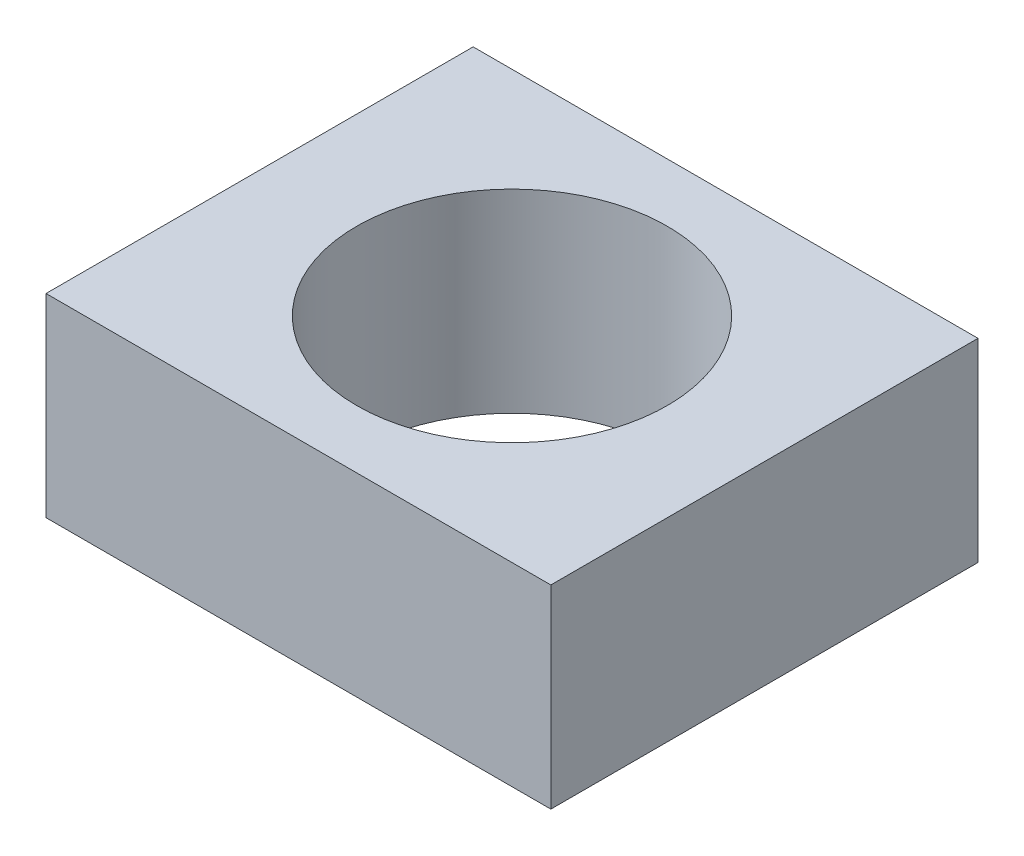
ISO-10303-21;
HEADER;
FILE_DESCRIPTION(('STEP AP214'),'2;1');
FILE_NAME('part.step','',(''),(''),'','','');
FILE_SCHEMA(('AUTOMOTIVE_DESIGN { 1 0 10303 214 1 1 1 1 }'));
ENDSEC;
DATA;
#1=APPLICATION_CONTEXT('core data for automotive mechanical design processes');
#2=APPLICATION_PROTOCOL_DEFINITION('international standard','automotive_design',2000,#1);
#3=PRODUCT_CONTEXT('',#1,'mechanical');
#4=PRODUCT('Part','Part','',(#3));
#5=PRODUCT_RELATED_PRODUCT_CATEGORY('part','',(#4));
#6=PRODUCT_DEFINITION_FORMATION('','',#4);
#7=PRODUCT_DEFINITION_CONTEXT('part definition',#1,'design');
#8=PRODUCT_DEFINITION('design','',#6,#7);
#9=PRODUCT_DEFINITION_SHAPE('','',#8);
#10=(LENGTH_UNIT() NAMED_UNIT(*) SI_UNIT(.MILLI.,.METRE.));
#11=(NAMED_UNIT(*) PLANE_ANGLE_UNIT() SI_UNIT($,.RADIAN.));
#12=(NAMED_UNIT(*) SI_UNIT($,.STERADIAN.) SOLID_ANGLE_UNIT());
#13=UNCERTAINTY_MEASURE_WITH_UNIT(LENGTH_MEASURE(1.E-05),#10,'distance_accuracy_value','');
#14=(GEOMETRIC_REPRESENTATION_CONTEXT(3) GLOBAL_UNCERTAINTY_ASSIGNED_CONTEXT((#13)) GLOBAL_UNIT_ASSIGNED_CONTEXT((#10,
#11,#12)) REPRESENTATION_CONTEXT('',''));
#15=CARTESIAN_POINT('',(0.,0.,0.));
#16=DIRECTION('',(0.,0.,1.));
#17=DIRECTION('',(1.,0.,0.));
#18=AXIS2_PLACEMENT_3D('',#15,#16,#17);
#19=CARTESIAN_POINT('',(6.5,5.,-5.5));
#20=DIRECTION('',(-1.,0.,0.));
#21=DIRECTION('',(0.,0.,1.));
#22=AXIS2_PLACEMENT_3D('',#19,#20,#21);
#23=PLANE('',#22);
#24=DIRECTION('',(0.,0.,-1.));
#25=VECTOR('',#24,1.);
#26=CARTESIAN_POINT('',(6.5,0.,-5.5));
#27=LINE('',#26,#25);
#28=CARTESIAN_POINT('',(6.5,0.,5.5));
#29=VERTEX_POINT('',#28);
#30=CARTESIAN_POINT('',(6.5,0.,-5.5));
#31=VERTEX_POINT('',#30);
#32=EDGE_CURVE('E107',#29,#31,#27,.T.);
#33=ORIENTED_EDGE('',*,*,#32,.T.);
#34=DIRECTION('',(0.,-1.,0.));
#35=VECTOR('',#34,1.);
#36=CARTESIAN_POINT('',(6.5,5.,-5.5));
#37=LINE('',#36,#35);
#38=CARTESIAN_POINT('',(6.5,5.,-5.5));
#39=VERTEX_POINT('',#38);
#40=EDGE_CURVE('E11',#39,#31,#37,.T.);
#41=ORIENTED_EDGE('',*,*,#40,.F.);
#42=DIRECTION('',(0.,0.,-1.));
#43=VECTOR('',#42,1.);
#44=CARTESIAN_POINT('',(6.5,5.,-5.5));
#45=LINE('',#44,#43);
#46=CARTESIAN_POINT('',(6.5,5.,5.5));
#47=VERTEX_POINT('',#46);
#48=EDGE_CURVE('E91',#47,#39,#45,.T.);
#49=ORIENTED_EDGE('',*,*,#48,.F.);
#50=DIRECTION('',(0.,-1.,0.));
#51=VECTOR('',#50,1.);
#52=CARTESIAN_POINT('',(6.5,5.,5.5));
#53=LINE('',#52,#51);
#54=EDGE_CURVE('E103',#47,#29,#53,.T.);
#55=ORIENTED_EDGE('',*,*,#54,.T.);
#56=EDGE_LOOP('',(#33,#41,#49,#55));
#57=FACE_BOUND('',#56,.T.);
#58=ADVANCED_FACE('F39',(#57),#23,.F.);
#59=CARTESIAN_POINT('',(-6.5,5.,-5.5));
#60=DIRECTION('',(0.,0.,1.));
#61=DIRECTION('',(1.,0.,0.));
#62=AXIS2_PLACEMENT_3D('',#59,#60,#61);
#63=PLANE('',#62);
#64=DIRECTION('',(-1.,0.,0.));
#65=VECTOR('',#64,1.);
#66=CARTESIAN_POINT('',(-6.5,0.,-5.5));
#67=LINE('',#66,#65);
#68=CARTESIAN_POINT('',(-6.5,0.,-5.5));
#69=VERTEX_POINT('',#68);
#70=EDGE_CURVE('E96',#31,#69,#67,.T.);
#71=ORIENTED_EDGE('',*,*,#70,.T.);
#72=DIRECTION('',(0.,-1.,0.));
#73=VECTOR('',#72,1.);
#74=CARTESIAN_POINT('',(-6.5,5.,-5.5));
#75=LINE('',#74,#73);
#76=CARTESIAN_POINT('',(-6.5,5.,-5.5));
#77=VERTEX_POINT('',#76);
#78=EDGE_CURVE('E48',#77,#69,#75,.T.);
#79=ORIENTED_EDGE('',*,*,#78,.F.);
#80=DIRECTION('',(-1.,0.,0.));
#81=VECTOR('',#80,1.);
#82=CARTESIAN_POINT('',(-6.5,5.,-5.5));
#83=LINE('',#82,#81);
#84=EDGE_CURVE('E86',#39,#77,#83,.T.);
#85=ORIENTED_EDGE('',*,*,#84,.F.);
#86=ORIENTED_EDGE('',*,*,#40,.T.);
#87=EDGE_LOOP('',(#71,#79,#85,#86));
#88=FACE_BOUND('',#87,.T.);
#89=ADVANCED_FACE('F95',(#88),#63,.F.);
#90=CARTESIAN_POINT('',(-6.5,5.,-5.5));
#91=DIRECTION('',(1.,0.,0.));
#92=DIRECTION('',(0.,0.,-1.));
#93=AXIS2_PLACEMENT_3D('',#90,#91,#92);
#94=PLANE('',#93);
#95=DIRECTION('',(0.,0.,1.));
#96=VECTOR('',#95,1.);
#97=CARTESIAN_POINT('',(-6.5,0.,-5.5));
#98=LINE('',#97,#96);
#99=CARTESIAN_POINT('',(-6.5,0.,5.5));
#100=VERTEX_POINT('',#99);
#101=EDGE_CURVE('E73',#69,#100,#98,.T.);
#102=ORIENTED_EDGE('',*,*,#101,.T.);
#103=DIRECTION('',(0.,-1.,0.));
#104=VECTOR('',#103,1.);
#105=CARTESIAN_POINT('',(-6.5,5.,5.5));
#106=LINE('',#105,#104);
#107=CARTESIAN_POINT('',(-6.5,5.,5.5));
#108=VERTEX_POINT('',#107);
#109=EDGE_CURVE('E98',#108,#100,#106,.T.);
#110=ORIENTED_EDGE('',*,*,#109,.F.);
#111=DIRECTION('',(0.,0.,1.));
#112=VECTOR('',#111,1.);
#113=CARTESIAN_POINT('',(-6.5,5.,-5.5));
#114=LINE('',#113,#112);
#115=EDGE_CURVE('E89',#77,#108,#114,.T.);
#116=ORIENTED_EDGE('',*,*,#115,.F.);
#117=ORIENTED_EDGE('',*,*,#78,.T.);
#118=EDGE_LOOP('',(#102,#110,#116,#117));
#119=FACE_BOUND('',#118,.T.);
#120=ADVANCED_FACE('F99',(#119),#94,.F.);
#121=CARTESIAN_POINT('',(-6.5,5.,5.5));
#122=DIRECTION('',(0.,0.,-1.));
#123=DIRECTION('',(-1.,0.,0.));
#124=AXIS2_PLACEMENT_3D('',#121,#122,#123);
#125=PLANE('',#124);
#126=DIRECTION('',(1.,0.,0.));
#127=VECTOR('',#126,1.);
#128=CARTESIAN_POINT('',(-6.5,0.,5.5));
#129=LINE('',#128,#127);
#130=EDGE_CURVE('E79',#100,#29,#129,.T.);
#131=ORIENTED_EDGE('',*,*,#130,.T.);
#132=ORIENTED_EDGE('',*,*,#54,.F.);
#133=DIRECTION('',(1.,0.,0.));
#134=VECTOR('',#133,1.);
#135=CARTESIAN_POINT('',(-6.5,5.,5.5));
#136=LINE('',#135,#134);
#137=EDGE_CURVE('E56',#108,#47,#136,.T.);
#138=ORIENTED_EDGE('',*,*,#137,.F.);
#139=ORIENTED_EDGE('',*,*,#109,.T.);
#140=EDGE_LOOP('',(#131,#132,#138,#139));
#141=FACE_BOUND('',#140,.T.);
#142=ADVANCED_FACE('F121',(#141),#125,.F.);
#143=CARTESIAN_POINT('',(0.,5.,0.));
#144=DIRECTION('',(0.,1.,0.));
#145=DIRECTION('',(0.,0.,1.));
#146=AXIS2_PLACEMENT_3D('',#143,#144,#145);
#147=PLANE('',#146);
#148=CARTESIAN_POINT('',(0.,5.,0.));
#149=DIRECTION('',(0.,1.,0.));
#150=DIRECTION('',(0.,0.,1.));
#151=AXIS2_PLACEMENT_3D('',#148,#149,#150);
#152=CIRCLE('',#151,4.);
#153=CARTESIAN_POINT('',(0.,5.,4.));
#154=VERTEX_POINT('',#153);
#155=EDGE_CURVE('E128',#154,#154,#152,.T.);
#156=ORIENTED_EDGE('',*,*,#155,.F.);
#157=EDGE_LOOP('',(#156));
#158=FACE_BOUND('',#157,.T.);
#159=ORIENTED_EDGE('',*,*,#48,.T.);
#160=ORIENTED_EDGE('',*,*,#84,.T.);
#161=ORIENTED_EDGE('',*,*,#115,.T.);
#162=ORIENTED_EDGE('',*,*,#137,.T.);
#163=EDGE_LOOP('',(#159,#160,#161,#162));
#164=FACE_BOUND('',#163,.T.);
#165=ADVANCED_FACE('F87',(#158,#164),#147,.T.);
#166=CARTESIAN_POINT('',(0.,0.,0.));
#167=DIRECTION('',(0.,1.,0.));
#168=DIRECTION('',(0.,0.,1.));
#169=AXIS2_PLACEMENT_3D('',#166,#167,#168);
#170=PLANE('',#169);
#171=CARTESIAN_POINT('',(0.,0.,0.));
#172=DIRECTION('',(0.,1.,0.));
#173=DIRECTION('',(0.,0.,1.));
#174=AXIS2_PLACEMENT_3D('',#171,#172,#173);
#175=CIRCLE('',#174,4.);
#176=CARTESIAN_POINT('',(0.,0.,4.));
#177=VERTEX_POINT('',#176);
#178=EDGE_CURVE('E111',#177,#177,#175,.T.);
#179=ORIENTED_EDGE('',*,*,#178,.T.);
#180=EDGE_LOOP('',(#179));
#181=FACE_BOUND('',#180,.T.);
#182=ORIENTED_EDGE('',*,*,#32,.F.);
#183=ORIENTED_EDGE('',*,*,#130,.F.);
#184=ORIENTED_EDGE('',*,*,#101,.F.);
#185=ORIENTED_EDGE('',*,*,#70,.F.);
#186=EDGE_LOOP('',(#182,#183,#184,#185));
#187=FACE_BOUND('',#186,.T.);
#188=ADVANCED_FACE('F124',(#181,#187),#170,.F.);
#189=CARTESIAN_POINT('',(0.,0.,0.));
#190=DIRECTION('',(0.,1.,0.));
#191=DIRECTION('',(0.,0.,1.));
#192=AXIS2_PLACEMENT_3D('',#189,#190,#191);
#193=CYLINDRICAL_SURFACE('',#192,4.);
#194=ORIENTED_EDGE('',*,*,#178,.F.);
#195=EDGE_LOOP('',(#194));
#196=FACE_BOUND('',#195,.T.);
#197=ORIENTED_EDGE('',*,*,#155,.T.);
#198=EDGE_LOOP('',(#197));
#199=FACE_BOUND('',#198,.T.);
#200=ADVANCED_FACE('F137',(#196,#199),#193,.F.);
#201=CLOSED_SHELL('',(#58,#89,#120,#142,#165,#188,#200));
#202=MANIFOLD_SOLID_BREP('B2',#201);
#203=ADVANCED_BREP_SHAPE_REPRESENTATION('',(#18,#202),#14);
#204=SHAPE_DEFINITION_REPRESENTATION(#9,#203);
ENDSEC;
END-ISO-10303-21;
